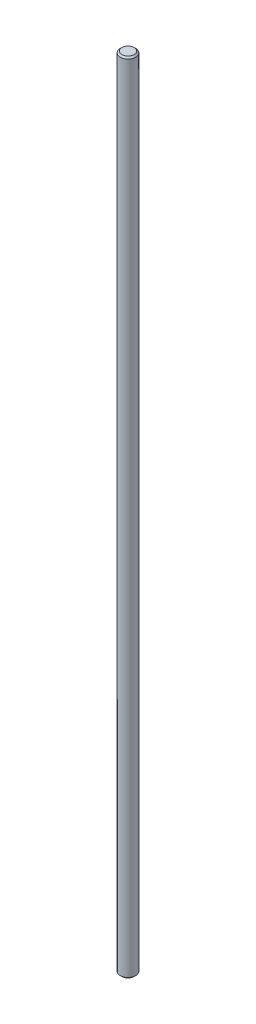
ISO-10303-21;
HEADER;
FILE_DESCRIPTION(('STEP AP214'),'2;1');
FILE_NAME('part.step','',(''),(''),'','','');
FILE_SCHEMA(('AUTOMOTIVE_DESIGN { 1 0 10303 214 1 1 1 1 }'));
ENDSEC;
DATA;
#1=APPLICATION_CONTEXT('core data for automotive mechanical design processes');
#2=APPLICATION_PROTOCOL_DEFINITION('international standard','automotive_design',2000,#1);
#3=PRODUCT_CONTEXT('',#1,'mechanical');
#4=PRODUCT('Part','Part','',(#3));
#5=PRODUCT_RELATED_PRODUCT_CATEGORY('part','',(#4));
#6=PRODUCT_DEFINITION_FORMATION('','',#4);
#7=PRODUCT_DEFINITION_CONTEXT('part definition',#1,'design');
#8=PRODUCT_DEFINITION('design','',#6,#7);
#9=PRODUCT_DEFINITION_SHAPE('','',#8);
#10=(LENGTH_UNIT() NAMED_UNIT(*) SI_UNIT(.MILLI.,.METRE.));
#11=(NAMED_UNIT(*) PLANE_ANGLE_UNIT() SI_UNIT($,.RADIAN.));
#12=(NAMED_UNIT(*) SI_UNIT($,.STERADIAN.) SOLID_ANGLE_UNIT());
#13=UNCERTAINTY_MEASURE_WITH_UNIT(LENGTH_MEASURE(1.E-05),#10,'distance_accuracy_value','');
#14=(GEOMETRIC_REPRESENTATION_CONTEXT(3) GLOBAL_UNCERTAINTY_ASSIGNED_CONTEXT((#13)) GLOBAL_UNIT_ASSIGNED_CONTEXT((#10,
#11,#12)) REPRESENTATION_CONTEXT('',''));
#15=CARTESIAN_POINT('',(0.,0.,0.));
#16=DIRECTION('',(0.,0.,1.));
#17=DIRECTION('',(1.,0.,0.));
#18=AXIS2_PLACEMENT_3D('',#15,#16,#17);
#19=CARTESIAN_POINT('',(0.,260.,0.));
#20=DIRECTION('',(0.,-1.,0.));
#21=DIRECTION('',(0.,0.,-1.));
#22=AXIS2_PLACEMENT_3D('',#19,#20,#21);
#23=CYLINDRICAL_SURFACE('',#22,5.);
#24=CARTESIAN_POINT('',(0.,-259.,0.));
#25=DIRECTION('',(0.,1.,0.));
#26=DIRECTION('',(0.,0.,1.));
#27=AXIS2_PLACEMENT_3D('',#24,#25,#26);
#28=CIRCLE('',#27,5.);
#29=CARTESIAN_POINT('',(0.,-259.,5.));
#30=VERTEX_POINT('',#29);
#31=EDGE_CURVE('E50',#30,#30,#28,.T.);
#32=ORIENTED_EDGE('',*,*,#31,.T.);
#33=EDGE_LOOP('',(#32));
#34=FACE_BOUND('',#33,.T.);
#35=CARTESIAN_POINT('',(0.,259.,0.));
#36=DIRECTION('',(0.,1.,0.));
#37=DIRECTION('',(0.,0.,1.));
#38=AXIS2_PLACEMENT_3D('',#35,#36,#37);
#39=CIRCLE('',#38,5.);
#40=CARTESIAN_POINT('',(0.,259.,5.));
#41=VERTEX_POINT('',#40);
#42=EDGE_CURVE('E55',#41,#41,#39,.F.);
#43=ORIENTED_EDGE('',*,*,#42,.T.);
#44=EDGE_LOOP('',(#43));
#45=FACE_BOUND('',#44,.T.);
#46=ADVANCED_FACE('F37',(#34,#45),#23,.T.);
#47=CARTESIAN_POINT('',(0.,260.,0.));
#48=DIRECTION('',(0.,1.,0.));
#49=DIRECTION('',(0.,0.,1.));
#50=AXIS2_PLACEMENT_3D('',#47,#48,#49);
#51=PLANE('',#50);
#52=CARTESIAN_POINT('',(0.,260.,0.));
#53=DIRECTION('',(0.,1.,0.));
#54=DIRECTION('',(0.,0.,1.));
#55=AXIS2_PLACEMENT_3D('',#52,#53,#54);
#56=CIRCLE('',#55,4.00000000000006);
#57=CARTESIAN_POINT('',(0.,260.,4.00000000000006));
#58=VERTEX_POINT('',#57);
#59=EDGE_CURVE('E10',#58,#58,#56,.T.);
#60=ORIENTED_EDGE('',*,*,#59,.T.);
#61=EDGE_LOOP('',(#60));
#62=FACE_BOUND('',#61,.T.);
#63=ADVANCED_FACE('F72',(#62),#51,.T.);
#64=CARTESIAN_POINT('',(0.,-260.,0.));
#65=DIRECTION('',(0.,1.,0.));
#66=DIRECTION('',(0.,0.,1.));
#67=AXIS2_PLACEMENT_3D('',#64,#65,#66);
#68=PLANE('',#67);
#69=CARTESIAN_POINT('',(0.,-260.,0.));
#70=DIRECTION('',(0.,1.,0.));
#71=DIRECTION('',(0.,0.,1.));
#72=AXIS2_PLACEMENT_3D('',#69,#70,#71);
#73=CIRCLE('',#72,4.);
#74=CARTESIAN_POINT('',(0.,-260.,4.));
#75=VERTEX_POINT('',#74);
#76=EDGE_CURVE('E45',#75,#75,#73,.F.);
#77=ORIENTED_EDGE('',*,*,#76,.T.);
#78=EDGE_LOOP('',(#77));
#79=FACE_BOUND('',#78,.T.);
#80=ADVANCED_FACE('F69',(#79),#68,.F.);
#81=CARTESIAN_POINT('',(0.,-259.,0.));
#82=DIRECTION('',(0.,1.,0.));
#83=DIRECTION('',(0.,0.,1.));
#84=AXIS2_PLACEMENT_3D('',#81,#82,#83);
#85=CONICAL_SURFACE('',#84,5.,0.785398163397391);
#86=ORIENTED_EDGE('',*,*,#76,.F.);
#87=EDGE_LOOP('',(#86));
#88=FACE_BOUND('',#87,.T.);
#89=ORIENTED_EDGE('',*,*,#31,.F.);
#90=EDGE_LOOP('',(#89));
#91=FACE_BOUND('',#90,.T.);
#92=ADVANCED_FACE('F65',(#88,#91),#85,.T.);
#93=CARTESIAN_POINT('',(0.,260.,0.));
#94=DIRECTION('',(0.,-1.,0.));
#95=DIRECTION('',(0.,0.,-1.));
#96=AXIS2_PLACEMENT_3D('',#93,#94,#95);
#97=CONICAL_SURFACE('',#96,4.00000000000006,0.785398163397446);
#98=ORIENTED_EDGE('',*,*,#42,.F.);
#99=EDGE_LOOP('',(#98));
#100=FACE_BOUND('',#99,.T.);
#101=ORIENTED_EDGE('',*,*,#59,.F.);
#102=EDGE_LOOP('',(#101));
#103=FACE_BOUND('',#102,.T.);
#104=ADVANCED_FACE('F39',(#100,#103),#97,.T.);
#105=CLOSED_SHELL('',(#46,#63,#80,#92,#104));
#106=MANIFOLD_SOLID_BREP('B2',#105);
#107=ADVANCED_BREP_SHAPE_REPRESENTATION('',(#18,#106),#14);
#108=SHAPE_DEFINITION_REPRESENTATION(#9,#107);
ENDSEC;
END-ISO-10303-21;
